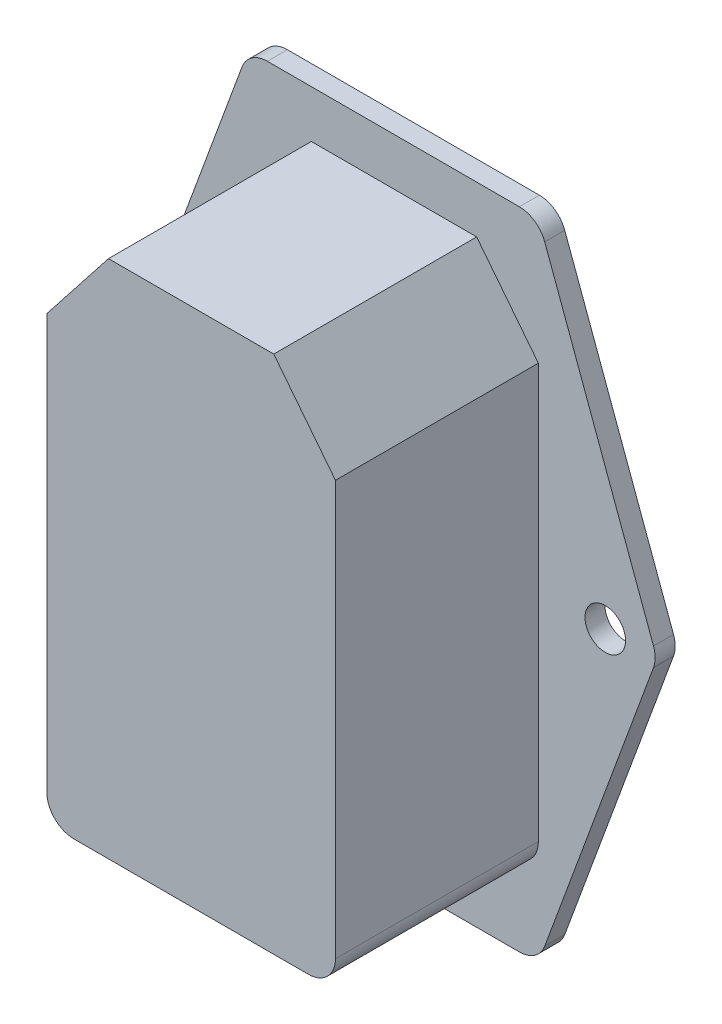
ISO-10303-21;
HEADER;
FILE_DESCRIPTION(('STEP AP214'),'2;1');
FILE_NAME('part.step','',(''),(''),'','','');
FILE_SCHEMA(('AUTOMOTIVE_DESIGN { 1 0 10303 214 1 1 1 1 }'));
ENDSEC;
DATA;
#1=APPLICATION_CONTEXT('core data for automotive mechanical design processes');
#2=APPLICATION_PROTOCOL_DEFINITION('international standard','automotive_design',2000,#1);
#3=PRODUCT_CONTEXT('',#1,'mechanical');
#4=PRODUCT('Part','Part','',(#3));
#5=PRODUCT_RELATED_PRODUCT_CATEGORY('part','',(#4));
#6=PRODUCT_DEFINITION_FORMATION('','',#4);
#7=PRODUCT_DEFINITION_CONTEXT('part definition',#1,'design');
#8=PRODUCT_DEFINITION('design','',#6,#7);
#9=PRODUCT_DEFINITION_SHAPE('','',#8);
#10=(LENGTH_UNIT() NAMED_UNIT(*) SI_UNIT(.MILLI.,.METRE.));
#11=(NAMED_UNIT(*) PLANE_ANGLE_UNIT() SI_UNIT($,.RADIAN.));
#12=(NAMED_UNIT(*) SI_UNIT($,.STERADIAN.) SOLID_ANGLE_UNIT());
#13=UNCERTAINTY_MEASURE_WITH_UNIT(LENGTH_MEASURE(1.E-05),#10,'distance_accuracy_value','');
#14=(GEOMETRIC_REPRESENTATION_CONTEXT(3) GLOBAL_UNCERTAINTY_ASSIGNED_CONTEXT((#13)) GLOBAL_UNIT_ASSIGNED_CONTEXT((#10,
#11,#12)) REPRESENTATION_CONTEXT('',''));
#15=CARTESIAN_POINT('',(0.,0.,0.));
#16=DIRECTION('',(0.,0.,1.));
#17=DIRECTION('',(1.,0.,0.));
#18=AXIS2_PLACEMENT_3D('',#15,#16,#17);
#19=CARTESIAN_POINT('',(2.54,2.54,19.0500000000001));
#20=DIRECTION('',(0.,0.,-1.));
#21=DIRECTION('',(-1.,0.,0.));
#22=AXIS2_PLACEMENT_3D('',#19,#20,#21);
#23=CYLINDRICAL_SURFACE('',#22,2.54);
#24=CARTESIAN_POINT('',(2.54,2.54,0.));
#25=DIRECTION('',(0.,0.,1.));
#26=DIRECTION('',(-1.,0.,0.));
#27=AXIS2_PLACEMENT_3D('',#24,#25,#26);
#28=CIRCLE('',#27,2.54);
#29=CARTESIAN_POINT('',(0.,2.54000000000002,0.));
#30=VERTEX_POINT('',#29);
#31=CARTESIAN_POINT('',(2.54000000000002,0.,0.));
#32=VERTEX_POINT('',#31);
#33=EDGE_CURVE('E291',#30,#32,#28,.T.);
#34=ORIENTED_EDGE('',*,*,#33,.T.);
#35=DIRECTION('',(0.,0.,-1.));
#36=VECTOR('',#35,1.);
#37=CARTESIAN_POINT('',(2.54000000000002,0.,19.0500000000001));
#38=LINE('',#37,#36);
#39=CARTESIAN_POINT('',(2.54000000000002,0.,19.0500000000001));
#40=VERTEX_POINT('',#39);
#41=EDGE_CURVE('E11',#40,#32,#38,.T.);
#42=ORIENTED_EDGE('',*,*,#41,.F.);
#43=CARTESIAN_POINT('',(2.54,2.54,19.0500000000001));
#44=DIRECTION('',(0.,0.,1.));
#45=DIRECTION('',(-1.,0.,0.));
#46=AXIS2_PLACEMENT_3D('',#43,#44,#45);
#47=CIRCLE('',#46,2.54);
#48=CARTESIAN_POINT('',(0.,2.54000000000002,19.0500000000001));
#49=VERTEX_POINT('',#48);
#50=EDGE_CURVE('E321',#49,#40,#47,.T.);
#51=ORIENTED_EDGE('',*,*,#50,.F.);
#52=DIRECTION('',(0.,0.,-1.));
#53=VECTOR('',#52,1.);
#54=CARTESIAN_POINT('',(0.,2.54000000000002,19.0500000000001));
#55=LINE('',#54,#53);
#56=EDGE_CURVE('E345',#49,#30,#55,.T.);
#57=ORIENTED_EDGE('',*,*,#56,.T.);
#58=EDGE_LOOP('',(#34,#42,#51,#57));
#59=FACE_BOUND('',#58,.T.);
#60=ADVANCED_FACE('F39',(#59),#23,.T.);
#61=CARTESIAN_POINT('',(2.54000000000002,0.,19.0500000000001));
#62=DIRECTION('',(0.,1.,0.));
#63=DIRECTION('',(0.,0.,1.));
#64=AXIS2_PLACEMENT_3D('',#61,#62,#63);
#65=PLANE('',#64);
#66=DIRECTION('',(1.,0.,0.));
#67=VECTOR('',#66,1.);
#68=CARTESIAN_POINT('',(2.54000000000002,0.,0.));
#69=LINE('',#68,#67);
#70=CARTESIAN_POINT('',(24.5618,0.,0.));
#71=VERTEX_POINT('',#70);
#72=EDGE_CURVE('E349',#32,#71,#69,.T.);
#73=ORIENTED_EDGE('',*,*,#72,.T.);
#74=DIRECTION('',(0.,0.,-1.));
#75=VECTOR('',#74,1.);
#76=CARTESIAN_POINT('',(24.5618,0.,19.0500000000001));
#77=LINE('',#76,#75);
#78=CARTESIAN_POINT('',(24.5618,0.,19.0500000000001));
#79=VERTEX_POINT('',#78);
#80=EDGE_CURVE('E49',#79,#71,#77,.T.);
#81=ORIENTED_EDGE('',*,*,#80,.F.);
#82=DIRECTION('',(1.,0.,0.));
#83=VECTOR('',#82,1.);
#84=CARTESIAN_POINT('',(2.54000000000002,0.,19.0500000000001));
#85=LINE('',#84,#83);
#86=EDGE_CURVE('E324',#40,#79,#85,.T.);
#87=ORIENTED_EDGE('',*,*,#86,.F.);
#88=ORIENTED_EDGE('',*,*,#41,.T.);
#89=EDGE_LOOP('',(#73,#81,#87,#88));
#90=FACE_BOUND('',#89,.T.);
#91=ADVANCED_FACE('F431',(#90),#65,.F.);
#92=CARTESIAN_POINT('',(24.5618,2.54,19.0500000000001));
#93=DIRECTION('',(0.,0.,-1.));
#94=DIRECTION('',(-1.,0.,0.));
#95=AXIS2_PLACEMENT_3D('',#92,#93,#94);
#96=CYLINDRICAL_SURFACE('',#95,2.54);
#97=CARTESIAN_POINT('',(24.5618,2.54,0.));
#98=DIRECTION('',(0.,0.,1.));
#99=DIRECTION('',(1.,0.,0.));
#100=AXIS2_PLACEMENT_3D('',#97,#98,#99);
#101=CIRCLE('',#100,2.54);
#102=CARTESIAN_POINT('',(27.1018,2.54,0.));
#103=VERTEX_POINT('',#102);
#104=EDGE_CURVE('E353',#71,#103,#101,.T.);
#105=ORIENTED_EDGE('',*,*,#104,.T.);
#106=DIRECTION('',(0.,0.,-1.));
#107=VECTOR('',#106,1.);
#108=CARTESIAN_POINT('',(27.1018,2.54,19.0500000000001));
#109=LINE('',#108,#107);
#110=CARTESIAN_POINT('',(27.1018,2.54,19.0500000000001));
#111=VERTEX_POINT('',#110);
#112=EDGE_CURVE('E395',#111,#103,#109,.T.);
#113=ORIENTED_EDGE('',*,*,#112,.F.);
#114=CARTESIAN_POINT('',(24.5618,2.54,19.0500000000001));
#115=DIRECTION('',(0.,0.,1.));
#116=DIRECTION('',(1.,0.,0.));
#117=AXIS2_PLACEMENT_3D('',#114,#115,#116);
#118=CIRCLE('',#117,2.54);
#119=EDGE_CURVE('E328',#79,#111,#118,.T.);
#120=ORIENTED_EDGE('',*,*,#119,.F.);
#121=ORIENTED_EDGE('',*,*,#80,.T.);
#122=EDGE_LOOP('',(#105,#113,#120,#121));
#123=FACE_BOUND('',#122,.T.);
#124=ADVANCED_FACE('F436',(#123),#96,.T.);
#125=CARTESIAN_POINT('',(27.1018,2.54000000000002,19.0500000000001));
#126=DIRECTION('',(-1.,0.,0.));
#127=DIRECTION('',(0.,0.,1.));
#128=AXIS2_PLACEMENT_3D('',#125,#126,#127);
#129=PLANE('',#128);
#130=DIRECTION('',(0.,1.,0.));
#131=VECTOR('',#130,1.);
#132=CARTESIAN_POINT('',(27.1018,2.54000000000002,0.));
#133=LINE('',#132,#131);
#134=CARTESIAN_POINT('',(27.1018,41.4401,0.));
#135=VERTEX_POINT('',#134);
#136=EDGE_CURVE('E357',#103,#135,#133,.T.);
#137=ORIENTED_EDGE('',*,*,#136,.T.);
#138=DIRECTION('',(0.,0.,-1.));
#139=VECTOR('',#138,1.);
#140=CARTESIAN_POINT('',(27.1018,41.4401,19.0500000000001));
#141=LINE('',#140,#139);
#142=CARTESIAN_POINT('',(27.1018,41.4401,19.0500000000001));
#143=VERTEX_POINT('',#142);
#144=EDGE_CURVE('E391',#143,#135,#141,.T.);
#145=ORIENTED_EDGE('',*,*,#144,.F.);
#146=DIRECTION('',(0.,1.,0.));
#147=VECTOR('',#146,1.);
#148=CARTESIAN_POINT('',(27.1018,2.54000000000002,19.0500000000001));
#149=LINE('',#148,#147);
#150=EDGE_CURVE('E331',#111,#143,#149,.T.);
#151=ORIENTED_EDGE('',*,*,#150,.F.);
#152=ORIENTED_EDGE('',*,*,#112,.T.);
#153=EDGE_LOOP('',(#137,#145,#151,#152));
#154=FACE_BOUND('',#153,.T.);
#155=ADVANCED_FACE('F459',(#154),#129,.F.);
#156=CARTESIAN_POINT('',(27.1018,41.4401,19.0500000000001));
#157=DIRECTION('',(-0.786267556224711,-0.617886178861787,0.));
#158=DIRECTION('',(0.617886178861787,-0.786267556224711,0.));
#159=AXIS2_PLACEMENT_3D('',#156,#157,#158);
#160=PLANE('',#159);
#161=DIRECTION('',(-0.617886178861787,0.786267556224711,0.));
#162=VECTOR('',#161,1.);
#163=CARTESIAN_POINT('',(27.1018,41.4401,0.));
#164=LINE('',#163,#162);
#165=CARTESIAN_POINT('',(21.3106,48.8094712974717,0.));
#166=VERTEX_POINT('',#165);
#167=EDGE_CURVE('E361',#135,#166,#164,.T.);
#168=ORIENTED_EDGE('',*,*,#167,.T.);
#169=DIRECTION('',(0.,0.,-1.));
#170=VECTOR('',#169,1.);
#171=CARTESIAN_POINT('',(21.3106,48.8094712974717,19.0500000000001));
#172=LINE('',#171,#170);
#173=CARTESIAN_POINT('',(21.3106,48.8094712974717,19.0500000000001));
#174=VERTEX_POINT('',#173);
#175=EDGE_CURVE('E387',#174,#166,#172,.T.);
#176=ORIENTED_EDGE('',*,*,#175,.F.);
#177=DIRECTION('',(-0.617886178861787,0.786267556224711,0.));
#178=VECTOR('',#177,1.);
#179=CARTESIAN_POINT('',(27.1018,41.4401,19.0500000000001));
#180=LINE('',#179,#178);
#181=EDGE_CURVE('E334',#143,#174,#180,.T.);
#182=ORIENTED_EDGE('',*,*,#181,.F.);
#183=ORIENTED_EDGE('',*,*,#144,.T.);
#184=EDGE_LOOP('',(#168,#176,#182,#183));
#185=FACE_BOUND('',#184,.T.);
#186=ADVANCED_FACE('F456',(#185),#160,.F.);
#187=CARTESIAN_POINT('',(21.3106,48.8094712974717,19.0500000000001));
#188=DIRECTION('',(0.,-1.,0.));
#189=DIRECTION('',(0.,0.,-1.));
#190=AXIS2_PLACEMENT_3D('',#187,#188,#189);
#191=PLANE('',#190);
#192=DIRECTION('',(-1.,0.,0.));
#193=VECTOR('',#192,1.);
#194=CARTESIAN_POINT('',(21.3106,48.8094712974717,0.));
#195=LINE('',#194,#193);
#196=CARTESIAN_POINT('',(5.79120000000001,48.8094712974717,0.));
#197=VERTEX_POINT('',#196);
#198=EDGE_CURVE('E365',#166,#197,#195,.T.);
#199=ORIENTED_EDGE('',*,*,#198,.T.);
#200=DIRECTION('',(0.,0.,-1.));
#201=VECTOR('',#200,1.);
#202=CARTESIAN_POINT('',(5.79120000000001,48.8094712974717,19.0500000000001));
#203=LINE('',#202,#201);
#204=CARTESIAN_POINT('',(5.79120000000001,48.8094712974717,19.0500000000001));
#205=VERTEX_POINT('',#204);
#206=EDGE_CURVE('E383',#205,#197,#203,.T.);
#207=ORIENTED_EDGE('',*,*,#206,.F.);
#208=DIRECTION('',(-1.,0.,0.));
#209=VECTOR('',#208,1.);
#210=CARTESIAN_POINT('',(21.3106,48.8094712974717,19.0500000000001));
#211=LINE('',#210,#209);
#212=EDGE_CURVE('E337',#174,#205,#211,.T.);
#213=ORIENTED_EDGE('',*,*,#212,.F.);
#214=ORIENTED_EDGE('',*,*,#175,.T.);
#215=EDGE_LOOP('',(#199,#207,#213,#214));
#216=FACE_BOUND('',#215,.T.);
#217=ADVANCED_FACE('F451',(#216),#191,.F.);
#218=CARTESIAN_POINT('',(0.,41.4401,19.0500000000001));
#219=DIRECTION('',(0.78626755622471,-0.617886178861789,0.));
#220=DIRECTION('',(0.617886178861789,0.78626755622471,0.));
#221=AXIS2_PLACEMENT_3D('',#218,#219,#220);
#222=PLANE('',#221);
#223=DIRECTION('',(-0.617886178861789,-0.78626755622471,0.));
#224=VECTOR('',#223,1.);
#225=CARTESIAN_POINT('',(0.,41.4401,0.));
#226=LINE('',#225,#224);
#227=CARTESIAN_POINT('',(0.,41.4401,0.));
#228=VERTEX_POINT('',#227);
#229=EDGE_CURVE('E369',#197,#228,#226,.T.);
#230=ORIENTED_EDGE('',*,*,#229,.T.);
#231=DIRECTION('',(0.,0.,-1.));
#232=VECTOR('',#231,1.);
#233=CARTESIAN_POINT('',(0.,41.4401,19.0500000000001));
#234=LINE('',#233,#232);
#235=CARTESIAN_POINT('',(0.,41.4401,19.0500000000001));
#236=VERTEX_POINT('',#235);
#237=EDGE_CURVE('E379',#236,#228,#234,.T.);
#238=ORIENTED_EDGE('',*,*,#237,.F.);
#239=DIRECTION('',(-0.617886178861789,-0.78626755622471,0.));
#240=VECTOR('',#239,1.);
#241=CARTESIAN_POINT('',(0.,41.4401,19.0500000000001));
#242=LINE('',#241,#240);
#243=EDGE_CURVE('E340',#205,#236,#242,.T.);
#244=ORIENTED_EDGE('',*,*,#243,.F.);
#245=ORIENTED_EDGE('',*,*,#206,.T.);
#246=EDGE_LOOP('',(#230,#238,#244,#245));
#247=FACE_BOUND('',#246,.T.);
#248=ADVANCED_FACE('F448',(#247),#222,.F.);
#249=CARTESIAN_POINT('',(0.,2.54000000000002,19.0500000000001));
#250=DIRECTION('',(1.,0.,0.));
#251=DIRECTION('',(0.,0.,-1.));
#252=AXIS2_PLACEMENT_3D('',#249,#250,#251);
#253=PLANE('',#252);
#254=DIRECTION('',(0.,-1.,0.));
#255=VECTOR('',#254,1.);
#256=CARTESIAN_POINT('',(0.,2.54000000000002,0.));
#257=LINE('',#256,#255);
#258=EDGE_CURVE('E325',#228,#30,#257,.T.);
#259=ORIENTED_EDGE('',*,*,#258,.T.);
#260=ORIENTED_EDGE('',*,*,#56,.F.);
#261=DIRECTION('',(0.,-1.,0.));
#262=VECTOR('',#261,1.);
#263=CARTESIAN_POINT('',(0.,2.54000000000002,19.0500000000001));
#264=LINE('',#263,#262);
#265=EDGE_CURVE('E57',#236,#49,#264,.T.);
#266=ORIENTED_EDGE('',*,*,#265,.F.);
#267=ORIENTED_EDGE('',*,*,#237,.T.);
#268=EDGE_LOOP('',(#259,#260,#266,#267));
#269=FACE_BOUND('',#268,.T.);
#270=ADVANCED_FACE('F444',(#269),#253,.F.);
#271=CARTESIAN_POINT('',(2.54,2.54,19.0500000000001));
#272=DIRECTION('',(0.,0.,-1.));
#273=DIRECTION('',(-1.,0.,0.));
#274=AXIS2_PLACEMENT_3D('',#271,#272,#273);
#275=PLANE('',#274);
#276=ORIENTED_EDGE('',*,*,#50,.T.);
#277=ORIENTED_EDGE('',*,*,#86,.T.);
#278=ORIENTED_EDGE('',*,*,#119,.T.);
#279=ORIENTED_EDGE('',*,*,#150,.T.);
#280=ORIENTED_EDGE('',*,*,#181,.T.);
#281=ORIENTED_EDGE('',*,*,#212,.T.);
#282=ORIENTED_EDGE('',*,*,#243,.T.);
#283=ORIENTED_EDGE('',*,*,#265,.T.);
#284=EDGE_LOOP('',(#276,#277,#278,#279,#280,#281,#282,#283));
#285=FACE_BOUND('',#284,.T.);
#286=ADVANCED_FACE('F465',(#285),#275,.F.);
#287=CARTESIAN_POINT('',(1.6575819845485,-4.7879,-1.8796));
#288=DIRECTION('',(0.,0.,1.));
#289=DIRECTION('',(1.,0.,0.));
#290=AXIS2_PLACEMENT_3D('',#287,#288,#289);
#291=CYLINDRICAL_SURFACE('',#290,2.54);
#292=CARTESIAN_POINT('',(1.6575819845485,-4.7879,0.));
#293=DIRECTION('',(0.,0.,1.));
#294=DIRECTION('',(-1.,0.,0.));
#295=AXIS2_PLACEMENT_3D('',#292,#293,#294);
#296=CIRCLE('',#295,2.54);
#297=CARTESIAN_POINT('',(-0.726168664542624,-5.66501620835419,0.));
#298=VERTEX_POINT('',#297);
#299=CARTESIAN_POINT('',(1.65758198454852,-7.3279,0.));
#300=VERTEX_POINT('',#299);
#301=EDGE_CURVE('E249',#298,#300,#296,.T.);
#302=ORIENTED_EDGE('',*,*,#301,.F.);
#303=DIRECTION('',(0.,0.,1.));
#304=VECTOR('',#303,1.);
#305=CARTESIAN_POINT('',(-0.726168664542624,-5.66501620835419,-1.8796));
#306=LINE('',#305,#304);
#307=CARTESIAN_POINT('',(-0.726168664542624,-5.66501620835419,-1.8796));
#308=VERTEX_POINT('',#307);
#309=EDGE_CURVE('E201',#308,#298,#306,.T.);
#310=ORIENTED_EDGE('',*,*,#309,.F.);
#311=CARTESIAN_POINT('',(1.6575819845485,-4.7879,-1.8796));
#312=DIRECTION('',(0.,0.,1.));
#313=DIRECTION('',(-1.,0.,0.));
#314=AXIS2_PLACEMENT_3D('',#311,#312,#313);
#315=CIRCLE('',#314,2.54);
#316=CARTESIAN_POINT('',(1.65758198454852,-7.3279,-1.8796));
#317=VERTEX_POINT('',#316);
#318=EDGE_CURVE('E193',#308,#317,#315,.T.);
#319=ORIENTED_EDGE('',*,*,#318,.T.);
#320=DIRECTION('',(0.,0.,1.));
#321=VECTOR('',#320,1.);
#322=CARTESIAN_POINT('',(1.65758198454852,-7.3279,-1.8796));
#323=LINE('',#322,#321);
#324=EDGE_CURVE('E174',#317,#300,#323,.T.);
#325=ORIENTED_EDGE('',*,*,#324,.T.);
#326=EDGE_LOOP('',(#302,#310,#319,#325));
#327=FACE_BOUND('',#326,.T.);
#328=ADVANCED_FACE('F200',(#327),#291,.T.);
#329=CARTESIAN_POINT('',(-0.726168664542624,-5.66501620835419,-1.8796));
#330=DIRECTION('',(-0.93848450751619,-0.345321341871732,0.));
#331=DIRECTION('',(0.345321341871732,-0.938484507516191,0.));
#332=AXIS2_PLACEMENT_3D('',#329,#330,#331);
#333=PLANE('',#332);
#334=DIRECTION('',(0.345321341871732,-0.93848450751619,0.));
#335=VECTOR('',#334,1.);
#336=CARTESIAN_POINT('',(-0.726168664542624,-5.66501620835419,0.));
#337=LINE('',#336,#335);
#338=CARTESIAN_POINT('',(-10.9397304021172,22.0925194403817,0.));
#339=VERTEX_POINT('',#338);
#340=EDGE_CURVE('E203',#339,#298,#337,.T.);
#341=ORIENTED_EDGE('',*,*,#340,.F.);
#342=DIRECTION('',(0.,0.,1.));
#343=VECTOR('',#342,1.);
#344=CARTESIAN_POINT('',(-10.9397304021172,22.0925194403817,-1.8796));
#345=LINE('',#344,#343);
#346=CARTESIAN_POINT('',(-10.9397304021172,22.0925194403817,-1.8796));
#347=VERTEX_POINT('',#346);
#348=EDGE_CURVE('E292',#347,#339,#345,.T.);
#349=ORIENTED_EDGE('',*,*,#348,.F.);
#350=DIRECTION('',(0.345321341871732,-0.93848450751619,0.));
#351=VECTOR('',#350,1.);
#352=CARTESIAN_POINT('',(-0.726168664542624,-5.66501620835419,-1.8796));
#353=LINE('',#352,#351);
#354=EDGE_CURVE('E186',#347,#308,#353,.T.);
#355=ORIENTED_EDGE('',*,*,#354,.T.);
#356=ORIENTED_EDGE('',*,*,#309,.T.);
#357=EDGE_LOOP('',(#341,#349,#355,#356));
#358=FACE_BOUND('',#357,.T.);
#359=ADVANCED_FACE('F472',(#358),#333,.T.);
#360=CARTESIAN_POINT('',(-8.55597975302609,22.9696356487359,-1.8796));
#361=DIRECTION('',(0.,0.,1.));
#362=DIRECTION('',(1.,0.,0.));
#363=AXIS2_PLACEMENT_3D('',#360,#361,#362);
#364=CYLINDRICAL_SURFACE('',#363,2.54);
#365=CARTESIAN_POINT('',(-8.55597975302609,22.9696356487359,0.));
#366=DIRECTION('',(0.,0.,1.));
#367=DIRECTION('',(-1.,0.,0.));
#368=AXIS2_PLACEMENT_3D('',#365,#366,#367);
#369=CIRCLE('',#368,2.54);
#370=CARTESIAN_POINT('',(-10.9397304021172,23.8467518570901,0.));
#371=VERTEX_POINT('',#370);
#372=EDGE_CURVE('E207',#371,#339,#369,.T.);
#373=ORIENTED_EDGE('',*,*,#372,.F.);
#374=DIRECTION('',(0.,0.,1.));
#375=VECTOR('',#374,1.);
#376=CARTESIAN_POINT('',(-10.9397304021172,23.8467518570901,-1.8796));
#377=LINE('',#376,#375);
#378=CARTESIAN_POINT('',(-10.9397304021172,23.8467518570901,-1.8796));
#379=VERTEX_POINT('',#378);
#380=EDGE_CURVE('E295',#379,#371,#377,.T.);
#381=ORIENTED_EDGE('',*,*,#380,.F.);
#382=CARTESIAN_POINT('',(-8.55597975302609,22.9696356487359,-1.8796));
#383=DIRECTION('',(0.,0.,1.));
#384=DIRECTION('',(-1.,0.,0.));
#385=AXIS2_PLACEMENT_3D('',#382,#383,#384);
#386=CIRCLE('',#385,2.54);
#387=EDGE_CURVE('E243',#379,#347,#386,.T.);
#388=ORIENTED_EDGE('',*,*,#387,.T.);
#389=ORIENTED_EDGE('',*,*,#348,.T.);
#390=EDGE_LOOP('',(#373,#381,#388,#389));
#391=FACE_BOUND('',#390,.T.);
#392=ADVANCED_FACE('F526',(#391),#364,.T.);
#393=CARTESIAN_POINT('',(-10.9397304021172,23.8467518570901,-1.8796));
#394=DIRECTION('',(-0.938484507516191,0.345321341871732,0.));
#395=DIRECTION('',(-0.345321341871732,-0.938484507516191,0.));
#396=AXIS2_PLACEMENT_3D('',#393,#394,#395);
#397=PLANE('',#396);
#398=DIRECTION('',(-0.345321341871732,-0.938484507516191,0.));
#399=VECTOR('',#398,1.);
#400=CARTESIAN_POINT('',(-10.9397304021172,23.8467518570901,0.));
#401=LINE('',#400,#399);
#402=CARTESIAN_POINT('',(-0.726168664542624,51.6042875058259,0.));
#403=VERTEX_POINT('',#402);
#404=EDGE_CURVE('E282',#403,#371,#401,.T.);
#405=ORIENTED_EDGE('',*,*,#404,.F.);
#406=DIRECTION('',(0.,0.,1.));
#407=VECTOR('',#406,1.);
#408=CARTESIAN_POINT('',(-0.726168664542624,51.6042875058259,-1.8796));
#409=LINE('',#408,#407);
#410=CARTESIAN_POINT('',(-0.726168664542624,51.6042875058259,-1.8796));
#411=VERTEX_POINT('',#410);
#412=EDGE_CURVE('E298',#411,#403,#409,.T.);
#413=ORIENTED_EDGE('',*,*,#412,.F.);
#414=DIRECTION('',(-0.345321341871732,-0.938484507516191,0.));
#415=VECTOR('',#414,1.);
#416=CARTESIAN_POINT('',(-10.9397304021172,23.8467518570901,-1.8796));
#417=LINE('',#416,#415);
#418=EDGE_CURVE('E239',#411,#379,#417,.T.);
#419=ORIENTED_EDGE('',*,*,#418,.T.);
#420=ORIENTED_EDGE('',*,*,#380,.T.);
#421=EDGE_LOOP('',(#405,#413,#419,#420));
#422=FACE_BOUND('',#421,.T.);
#423=ADVANCED_FACE('F536',(#422),#397,.T.);
#424=CARTESIAN_POINT('',(1.6575819845485,50.7271712974717,-1.8796));
#425=DIRECTION('',(0.,0.,1.));
#426=DIRECTION('',(1.,0.,0.));
#427=AXIS2_PLACEMENT_3D('',#424,#425,#426);
#428=CYLINDRICAL_SURFACE('',#427,2.54);
#429=CARTESIAN_POINT('',(1.6575819845485,50.7271712974717,0.));
#430=DIRECTION('',(0.,0.,1.));
#431=DIRECTION('',(-1.,0.,0.));
#432=AXIS2_PLACEMENT_3D('',#429,#430,#431);
#433=CIRCLE('',#432,2.54);
#434=CARTESIAN_POINT('',(1.65758198454852,53.2671712974717,0.));
#435=VERTEX_POINT('',#434);
#436=EDGE_CURVE('E278',#435,#403,#433,.T.);
#437=ORIENTED_EDGE('',*,*,#436,.F.);
#438=DIRECTION('',(0.,0.,1.));
#439=VECTOR('',#438,1.);
#440=CARTESIAN_POINT('',(1.65758198454852,53.2671712974717,-1.8796));
#441=LINE('',#440,#439);
#442=CARTESIAN_POINT('',(1.65758198454852,53.2671712974717,-1.8796));
#443=VERTEX_POINT('',#442);
#444=EDGE_CURVE('E301',#443,#435,#441,.T.);
#445=ORIENTED_EDGE('',*,*,#444,.F.);
#446=CARTESIAN_POINT('',(1.6575819845485,50.7271712974717,-1.8796));
#447=DIRECTION('',(0.,0.,1.));
#448=DIRECTION('',(-1.,0.,0.));
#449=AXIS2_PLACEMENT_3D('',#446,#447,#448);
#450=CIRCLE('',#449,2.54);
#451=EDGE_CURVE('E235',#443,#411,#450,.T.);
#452=ORIENTED_EDGE('',*,*,#451,.T.);
#453=ORIENTED_EDGE('',*,*,#412,.T.);
#454=EDGE_LOOP('',(#437,#445,#452,#453));
#455=FACE_BOUND('',#454,.T.);
#456=ADVANCED_FACE('F546',(#455),#428,.T.);
#457=CARTESIAN_POINT('',(1.65758198454852,53.2671712974717,-1.8796));
#458=DIRECTION('',(0.,1.,0.));
#459=DIRECTION('',(0.,0.,1.));
#460=AXIS2_PLACEMENT_3D('',#457,#458,#459);
#461=PLANE('',#460);
#462=DIRECTION('',(-1.,0.,0.));
#463=VECTOR('',#462,1.);
#464=CARTESIAN_POINT('',(1.65758198454852,53.2671712974717,0.));
#465=LINE('',#464,#463);
#466=CARTESIAN_POINT('',(25.3172180154515,53.2671712974717,0.));
#467=VERTEX_POINT('',#466);
#468=EDGE_CURVE('E274',#467,#435,#465,.T.);
#469=ORIENTED_EDGE('',*,*,#468,.F.);
#470=DIRECTION('',(0.,0.,1.));
#471=VECTOR('',#470,1.);
#472=CARTESIAN_POINT('',(25.3172180154515,53.2671712974717,-1.8796));
#473=LINE('',#472,#471);
#474=CARTESIAN_POINT('',(25.3172180154515,53.2671712974717,-1.8796));
#475=VERTEX_POINT('',#474);
#476=EDGE_CURVE('E304',#475,#467,#473,.T.);
#477=ORIENTED_EDGE('',*,*,#476,.F.);
#478=DIRECTION('',(-1.,0.,0.));
#479=VECTOR('',#478,1.);
#480=CARTESIAN_POINT('',(1.65758198454852,53.2671712974717,-1.8796));
#481=LINE('',#480,#479);
#482=EDGE_CURVE('E231',#475,#443,#481,.T.);
#483=ORIENTED_EDGE('',*,*,#482,.T.);
#484=ORIENTED_EDGE('',*,*,#444,.T.);
#485=EDGE_LOOP('',(#469,#477,#483,#484));
#486=FACE_BOUND('',#485,.T.);
#487=ADVANCED_FACE('F556',(#486),#461,.T.);
#488=CARTESIAN_POINT('',(25.3172180154515,50.7271712974717,-1.8796));
#489=DIRECTION('',(0.,0.,1.));
#490=DIRECTION('',(1.,0.,0.));
#491=AXIS2_PLACEMENT_3D('',#488,#489,#490);
#492=CYLINDRICAL_SURFACE('',#491,2.54);
#493=CARTESIAN_POINT('',(25.3172180154515,50.7271712974717,0.));
#494=DIRECTION('',(0.,0.,1.));
#495=DIRECTION('',(1.,0.,0.));
#496=AXIS2_PLACEMENT_3D('',#493,#494,#495);
#497=CIRCLE('',#496,2.54);
#498=CARTESIAN_POINT('',(27.7009686645426,51.6042875058259,0.));
#499=VERTEX_POINT('',#498);
#500=EDGE_CURVE('E270',#499,#467,#497,.T.);
#501=ORIENTED_EDGE('',*,*,#500,.F.);
#502=DIRECTION('',(0.,0.,1.));
#503=VECTOR('',#502,1.);
#504=CARTESIAN_POINT('',(27.7009686645426,51.6042875058259,-1.8796));
#505=LINE('',#504,#503);
#506=CARTESIAN_POINT('',(27.7009686645426,51.6042875058259,-1.8796));
#507=VERTEX_POINT('',#506);
#508=EDGE_CURVE('E307',#507,#499,#505,.T.);
#509=ORIENTED_EDGE('',*,*,#508,.F.);
#510=CARTESIAN_POINT('',(25.3172180154515,50.7271712974717,-1.8796));
#511=DIRECTION('',(0.,0.,1.));
#512=DIRECTION('',(1.,0.,0.));
#513=AXIS2_PLACEMENT_3D('',#510,#511,#512);
#514=CIRCLE('',#513,2.54);
#515=EDGE_CURVE('E227',#507,#475,#514,.T.);
#516=ORIENTED_EDGE('',*,*,#515,.T.);
#517=ORIENTED_EDGE('',*,*,#476,.T.);
#518=EDGE_LOOP('',(#501,#509,#516,#517));
#519=FACE_BOUND('',#518,.T.);
#520=ADVANCED_FACE('F566',(#519),#492,.T.);
#521=CARTESIAN_POINT('',(27.7009686645426,51.6042875058259,-1.8796));
#522=DIRECTION('',(0.938484507516191,0.345321341871732,0.));
#523=DIRECTION('',(-0.345321341871732,0.938484507516191,0.));
#524=AXIS2_PLACEMENT_3D('',#521,#522,#523);
#525=PLANE('',#524);
#526=DIRECTION('',(-0.345321341871732,0.938484507516191,0.));
#527=VECTOR('',#526,1.);
#528=CARTESIAN_POINT('',(27.7009686645426,51.6042875058259,0.));
#529=LINE('',#528,#527);
#530=CARTESIAN_POINT('',(37.9145304021172,23.8467518570901,0.));
#531=VERTEX_POINT('',#530);
#532=EDGE_CURVE('E266',#531,#499,#529,.T.);
#533=ORIENTED_EDGE('',*,*,#532,.F.);
#534=DIRECTION('',(0.,0.,1.));
#535=VECTOR('',#534,1.);
#536=CARTESIAN_POINT('',(37.9145304021172,23.8467518570901,-1.8796));
#537=LINE('',#536,#535);
#538=CARTESIAN_POINT('',(37.9145304021172,23.8467518570901,-1.8796));
#539=VERTEX_POINT('',#538);
#540=EDGE_CURVE('E310',#539,#531,#537,.T.);
#541=ORIENTED_EDGE('',*,*,#540,.F.);
#542=DIRECTION('',(-0.345321341871732,0.938484507516191,0.));
#543=VECTOR('',#542,1.);
#544=CARTESIAN_POINT('',(27.7009686645426,51.6042875058259,-1.8796));
#545=LINE('',#544,#543);
#546=EDGE_CURVE('E223',#539,#507,#545,.T.);
#547=ORIENTED_EDGE('',*,*,#546,.T.);
#548=ORIENTED_EDGE('',*,*,#508,.T.);
#549=EDGE_LOOP('',(#533,#541,#547,#548));
#550=FACE_BOUND('',#549,.T.);
#551=ADVANCED_FACE('F576',(#550),#525,.T.);
#552=CARTESIAN_POINT('',(35.5307797530261,22.9696356487359,-1.8796));
#553=DIRECTION('',(0.,0.,1.));
#554=DIRECTION('',(1.,0.,0.));
#555=AXIS2_PLACEMENT_3D('',#552,#553,#554);
#556=CYLINDRICAL_SURFACE('',#555,2.54);
#557=CARTESIAN_POINT('',(35.5307797530261,22.9696356487359,0.));
#558=DIRECTION('',(0.,0.,1.));
#559=DIRECTION('',(1.,0.,0.));
#560=AXIS2_PLACEMENT_3D('',#557,#558,#559);
#561=CIRCLE('',#560,2.54);
#562=CARTESIAN_POINT('',(37.9145304021172,22.0925194403817,0.));
#563=VERTEX_POINT('',#562);
#564=EDGE_CURVE('E262',#563,#531,#561,.T.);
#565=ORIENTED_EDGE('',*,*,#564,.F.);
#566=DIRECTION('',(0.,0.,1.));
#567=VECTOR('',#566,1.);
#568=CARTESIAN_POINT('',(37.9145304021172,22.0925194403817,-1.8796));
#569=LINE('',#568,#567);
#570=CARTESIAN_POINT('',(37.9145304021172,22.0925194403817,-1.8796));
#571=VERTEX_POINT('',#570);
#572=EDGE_CURVE('E313',#571,#563,#569,.T.);
#573=ORIENTED_EDGE('',*,*,#572,.F.);
#574=CARTESIAN_POINT('',(35.5307797530261,22.9696356487359,-1.8796));
#575=DIRECTION('',(0.,0.,1.));
#576=DIRECTION('',(1.,0.,0.));
#577=AXIS2_PLACEMENT_3D('',#574,#575,#576);
#578=CIRCLE('',#577,2.54);
#579=EDGE_CURVE('E219',#571,#539,#578,.T.);
#580=ORIENTED_EDGE('',*,*,#579,.T.);
#581=ORIENTED_EDGE('',*,*,#540,.T.);
#582=EDGE_LOOP('',(#565,#573,#580,#581));
#583=FACE_BOUND('',#582,.T.);
#584=ADVANCED_FACE('F586',(#583),#556,.T.);
#585=CARTESIAN_POINT('',(37.9145304021172,22.0925194403817,-1.8796));
#586=DIRECTION('',(0.938484507516191,-0.345321341871732,0.));
#587=DIRECTION('',(0.345321341871732,0.938484507516191,0.));
#588=AXIS2_PLACEMENT_3D('',#585,#586,#587);
#589=PLANE('',#588);
#590=DIRECTION('',(0.345321341871732,0.93848450751619,0.));
#591=VECTOR('',#590,1.);
#592=CARTESIAN_POINT('',(37.9145304021172,22.0925194403817,0.));
#593=LINE('',#592,#591);
#594=CARTESIAN_POINT('',(27.7009686645426,-5.66501620835419,0.));
#595=VERTEX_POINT('',#594);
#596=EDGE_CURVE('E258',#595,#563,#593,.T.);
#597=ORIENTED_EDGE('',*,*,#596,.F.);
#598=DIRECTION('',(0.,0.,1.));
#599=VECTOR('',#598,1.);
#600=CARTESIAN_POINT('',(27.7009686645426,-5.66501620835419,-1.8796));
#601=LINE('',#600,#599);
#602=CARTESIAN_POINT('',(27.7009686645426,-5.66501620835419,-1.8796));
#603=VERTEX_POINT('',#602);
#604=EDGE_CURVE('E316',#603,#595,#601,.T.);
#605=ORIENTED_EDGE('',*,*,#604,.F.);
#606=DIRECTION('',(0.345321341871732,0.93848450751619,0.));
#607=VECTOR('',#606,1.);
#608=CARTESIAN_POINT('',(37.9145304021172,22.0925194403817,-1.8796));
#609=LINE('',#608,#607);
#610=EDGE_CURVE('E215',#603,#571,#609,.T.);
#611=ORIENTED_EDGE('',*,*,#610,.T.);
#612=ORIENTED_EDGE('',*,*,#572,.T.);
#613=EDGE_LOOP('',(#597,#605,#611,#612));
#614=FACE_BOUND('',#613,.T.);
#615=ADVANCED_FACE('F596',(#614),#589,.T.);
#616=CARTESIAN_POINT('',(25.3172180154515,-4.7879,-1.8796));
#617=DIRECTION('',(0.,0.,1.));
#618=DIRECTION('',(1.,0.,0.));
#619=AXIS2_PLACEMENT_3D('',#616,#617,#618);
#620=CYLINDRICAL_SURFACE('',#619,2.54);
#621=CARTESIAN_POINT('',(25.3172180154515,-4.7879,0.));
#622=DIRECTION('',(0.,0.,1.));
#623=DIRECTION('',(-1.,0.,0.));
#624=AXIS2_PLACEMENT_3D('',#621,#622,#623);
#625=CIRCLE('',#624,2.54);
#626=CARTESIAN_POINT('',(25.3172180154515,-7.3279,0.));
#627=VERTEX_POINT('',#626);
#628=EDGE_CURVE('E254',#627,#595,#625,.T.);
#629=ORIENTED_EDGE('',*,*,#628,.F.);
#630=DIRECTION('',(0.,0.,1.));
#631=VECTOR('',#630,1.);
#632=CARTESIAN_POINT('',(25.3172180154515,-7.3279,-1.8796));
#633=LINE('',#632,#631);
#634=CARTESIAN_POINT('',(25.3172180154515,-7.3279,-1.8796));
#635=VERTEX_POINT('',#634);
#636=EDGE_CURVE('E185',#635,#627,#633,.T.);
#637=ORIENTED_EDGE('',*,*,#636,.F.);
#638=CARTESIAN_POINT('',(25.3172180154515,-4.7879,-1.8796));
#639=DIRECTION('',(0.,0.,1.));
#640=DIRECTION('',(-1.,0.,0.));
#641=AXIS2_PLACEMENT_3D('',#638,#639,#640);
#642=CIRCLE('',#641,2.54);
#643=EDGE_CURVE('E197',#635,#603,#642,.T.);
#644=ORIENTED_EDGE('',*,*,#643,.T.);
#645=ORIENTED_EDGE('',*,*,#604,.T.);
#646=EDGE_LOOP('',(#629,#637,#644,#645));
#647=FACE_BOUND('',#646,.T.);
#648=ADVANCED_FACE('F606',(#647),#620,.T.);
#649=CARTESIAN_POINT('',(25.3172180154515,-7.3279,-1.8796));
#650=DIRECTION('',(0.,-1.,0.));
#651=DIRECTION('',(1.,0.,0.));
#652=AXIS2_PLACEMENT_3D('',#649,#650,#651);
#653=PLANE('',#652);
#654=DIRECTION('',(1.,0.,0.));
#655=VECTOR('',#654,1.);
#656=CARTESIAN_POINT('',(25.3172180154515,-7.3279,0.));
#657=LINE('',#656,#655);
#658=EDGE_CURVE('E179',#300,#627,#657,.T.);
#659=ORIENTED_EDGE('',*,*,#658,.F.);
#660=ORIENTED_EDGE('',*,*,#324,.F.);
#661=DIRECTION('',(1.,0.,0.));
#662=VECTOR('',#661,1.);
#663=CARTESIAN_POINT('',(25.3172180154515,-7.3279,-1.8796));
#664=LINE('',#663,#662);
#665=EDGE_CURVE('E177',#317,#635,#664,.T.);
#666=ORIENTED_EDGE('',*,*,#665,.T.);
#667=ORIENTED_EDGE('',*,*,#636,.T.);
#668=EDGE_LOOP('',(#659,#660,#666,#667));
#669=FACE_BOUND('',#668,.T.);
#670=ADVANCED_FACE('F176',(#669),#653,.T.);
#671=CARTESIAN_POINT('',(1.6575819845485,-4.7879,-1.8796));
#672=DIRECTION('',(0.,0.,-1.));
#673=DIRECTION('',(-1.,0.,0.));
#674=AXIS2_PLACEMENT_3D('',#671,#672,#673);
#675=PLANE('',#674);
#676=CARTESIAN_POINT('',(33.3844797530261,22.9696356487359,-1.8796));
#677=DIRECTION('',(0.,0.,-1.));
#678=DIRECTION('',(-1.,0.,0.));
#679=AXIS2_PLACEMENT_3D('',#676,#677,#678);
#680=CIRCLE('',#679,1.905);
#681=CARTESIAN_POINT('',(31.4794797530261,22.9696356487359,-1.8796));
#682=VERTEX_POINT('',#681);
#683=EDGE_CURVE('E210',#682,#682,#680,.F.);
#684=ORIENTED_EDGE('',*,*,#683,.T.);
#685=EDGE_LOOP('',(#684));
#686=FACE_BOUND('',#685,.T.);
#687=CARTESIAN_POINT('',(-6.40967975302609,22.9696356487359,-1.8796));
#688=DIRECTION('',(0.,0.,-1.));
#689=DIRECTION('',(-1.,0.,0.));
#690=AXIS2_PLACEMENT_3D('',#687,#688,#689);
#691=CIRCLE('',#690,1.905);
#692=CARTESIAN_POINT('',(-8.31467975302609,22.9696356487359,-1.8796));
#693=VERTEX_POINT('',#692);
#694=EDGE_CURVE('E404',#693,#693,#691,.F.);
#695=ORIENTED_EDGE('',*,*,#694,.T.);
#696=EDGE_LOOP('',(#695));
#697=FACE_BOUND('',#696,.T.);
#698=ORIENTED_EDGE('',*,*,#318,.F.);
#699=ORIENTED_EDGE('',*,*,#354,.F.);
#700=ORIENTED_EDGE('',*,*,#387,.F.);
#701=ORIENTED_EDGE('',*,*,#418,.F.);
#702=ORIENTED_EDGE('',*,*,#451,.F.);
#703=ORIENTED_EDGE('',*,*,#482,.F.);
#704=ORIENTED_EDGE('',*,*,#515,.F.);
#705=ORIENTED_EDGE('',*,*,#546,.F.);
#706=ORIENTED_EDGE('',*,*,#579,.F.);
#707=ORIENTED_EDGE('',*,*,#610,.F.);
#708=ORIENTED_EDGE('',*,*,#643,.F.);
#709=ORIENTED_EDGE('',*,*,#665,.F.);
#710=EDGE_LOOP('',(#698,#699,#700,#701,#702,#703,#704,#705,#706,#707,#708,#709));
#711=FACE_BOUND('',#710,.T.);
#712=ADVANCED_FACE('F191',(#686,#697,#711),#675,.T.);
#713=CARTESIAN_POINT('',(1.6575819845485,-4.7879,0.));
#714=DIRECTION('',(0.,0.,-1.));
#715=DIRECTION('',(-1.,0.,0.));
#716=AXIS2_PLACEMENT_3D('',#713,#714,#715);
#717=PLANE('',#716);
#718=CARTESIAN_POINT('',(33.3844797530261,22.9696356487359,0.));
#719=DIRECTION('',(0.,0.,-1.));
#720=DIRECTION('',(-1.,0.,0.));
#721=AXIS2_PLACEMENT_3D('',#718,#719,#720);
#722=CIRCLE('',#721,1.905);
#723=CARTESIAN_POINT('',(31.4794797530261,22.9696356487359,0.));
#724=VERTEX_POINT('',#723);
#725=EDGE_CURVE('E42',#724,#724,#722,.F.);
#726=ORIENTED_EDGE('',*,*,#725,.F.);
#727=EDGE_LOOP('',(#726));
#728=FACE_BOUND('',#727,.T.);
#729=CARTESIAN_POINT('',(-6.40967975302609,22.9696356487359,0.));
#730=DIRECTION('',(0.,0.,-1.));
#731=DIRECTION('',(-1.,0.,0.));
#732=AXIS2_PLACEMENT_3D('',#729,#730,#731);
#733=CIRCLE('',#732,1.905);
#734=CARTESIAN_POINT('',(-8.31467975302609,22.9696356487359,0.));
#735=VERTEX_POINT('',#734);
#736=EDGE_CURVE('E401',#735,#735,#733,.F.);
#737=ORIENTED_EDGE('',*,*,#736,.F.);
#738=EDGE_LOOP('',(#737));
#739=FACE_BOUND('',#738,.T.);
#740=ORIENTED_EDGE('',*,*,#33,.F.);
#741=ORIENTED_EDGE('',*,*,#258,.F.);
#742=ORIENTED_EDGE('',*,*,#229,.F.);
#743=ORIENTED_EDGE('',*,*,#198,.F.);
#744=ORIENTED_EDGE('',*,*,#167,.F.);
#745=ORIENTED_EDGE('',*,*,#136,.F.);
#746=ORIENTED_EDGE('',*,*,#104,.F.);
#747=ORIENTED_EDGE('',*,*,#72,.F.);
#748=EDGE_LOOP('',(#740,#741,#742,#743,#744,#745,#746,#747));
#749=FACE_BOUND('',#748,.T.);
#750=ORIENTED_EDGE('',*,*,#301,.T.);
#751=ORIENTED_EDGE('',*,*,#658,.T.);
#752=ORIENTED_EDGE('',*,*,#628,.T.);
#753=ORIENTED_EDGE('',*,*,#596,.T.);
#754=ORIENTED_EDGE('',*,*,#564,.T.);
#755=ORIENTED_EDGE('',*,*,#532,.T.);
#756=ORIENTED_EDGE('',*,*,#500,.T.);
#757=ORIENTED_EDGE('',*,*,#468,.T.);
#758=ORIENTED_EDGE('',*,*,#436,.T.);
#759=ORIENTED_EDGE('',*,*,#404,.T.);
#760=ORIENTED_EDGE('',*,*,#372,.T.);
#761=ORIENTED_EDGE('',*,*,#340,.T.);
#762=EDGE_LOOP('',(#750,#751,#752,#753,#754,#755,#756,#757,#758,#759,#760,#761));
#763=FACE_BOUND('',#762,.T.);
#764=ADVANCED_FACE('F427',(#728,#739,#749,#763),#717,.F.);
#765=CARTESIAN_POINT('',(-6.40967975302609,22.9696356487359,22.606));
#766=DIRECTION('',(0.,0.,-1.));
#767=DIRECTION('',(-1.,0.,0.));
#768=AXIS2_PLACEMENT_3D('',#765,#766,#767);
#769=CYLINDRICAL_SURFACE('',#768,1.905);
#770=ORIENTED_EDGE('',*,*,#694,.F.);
#771=EDGE_LOOP('',(#770));
#772=FACE_BOUND('',#771,.T.);
#773=ORIENTED_EDGE('',*,*,#736,.T.);
#774=EDGE_LOOP('',(#773));
#775=FACE_BOUND('',#774,.T.);
#776=ADVANCED_FACE('F422',(#772,#775),#769,.F.);
#777=CARTESIAN_POINT('',(33.3844797530261,22.9696356487359,22.606));
#778=DIRECTION('',(0.,0.,-1.));
#779=DIRECTION('',(-1.,0.,0.));
#780=AXIS2_PLACEMENT_3D('',#777,#778,#779);
#781=CYLINDRICAL_SURFACE('',#780,1.905);
#782=ORIENTED_EDGE('',*,*,#683,.F.);
#783=EDGE_LOOP('',(#782));
#784=FACE_BOUND('',#783,.T.);
#785=ORIENTED_EDGE('',*,*,#725,.T.);
#786=EDGE_LOOP('',(#785));
#787=FACE_BOUND('',#786,.T.);
#788=ADVANCED_FACE('F420',(#784,#787),#781,.F.);
#789=CLOSED_SHELL('',(#60,#91,#124,#155,#186,#217,#248,#270,#286,#328,#359,#392,#423,#456,#487,
#520,#551,#584,#615,#648,#670,#712,#764,#776,#788));
#790=MANIFOLD_SOLID_BREP('B2',#789);
#791=ADVANCED_BREP_SHAPE_REPRESENTATION('',(#18,#790),#14);
#792=SHAPE_DEFINITION_REPRESENTATION(#9,#791);
ENDSEC;
END-ISO-10303-21;
